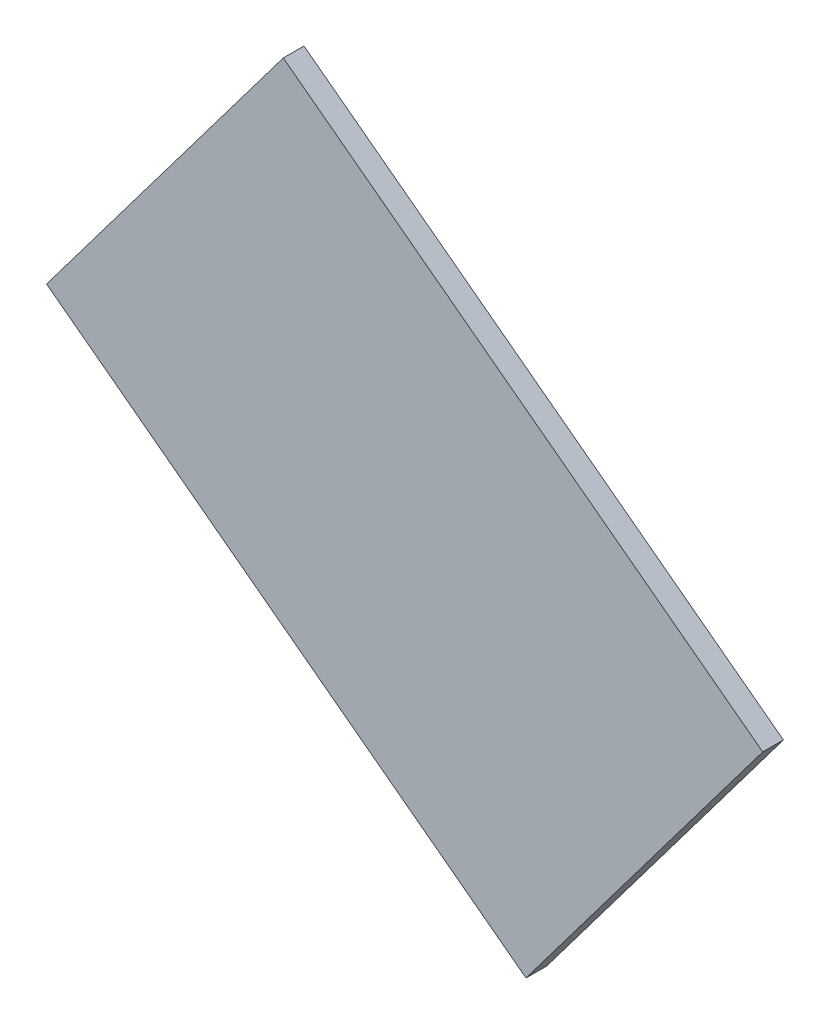
ISO-10303-21;
HEADER;
FILE_DESCRIPTION(('STEP AP214'),'2;1');
FILE_NAME('part.step','',(''),(''),'','','');
FILE_SCHEMA(('AUTOMOTIVE_DESIGN { 1 0 10303 214 1 1 1 1 }'));
ENDSEC;
DATA;
#1=APPLICATION_CONTEXT('core data for automotive mechanical design processes');
#2=APPLICATION_PROTOCOL_DEFINITION('international standard','automotive_design',2000,#1);
#3=PRODUCT_CONTEXT('',#1,'mechanical');
#4=PRODUCT('Part','Part','',(#3));
#5=PRODUCT_RELATED_PRODUCT_CATEGORY('part','',(#4));
#6=PRODUCT_DEFINITION_FORMATION('','',#4);
#7=PRODUCT_DEFINITION_CONTEXT('part definition',#1,'design');
#8=PRODUCT_DEFINITION('design','',#6,#7);
#9=PRODUCT_DEFINITION_SHAPE('','',#8);
#10=(LENGTH_UNIT() NAMED_UNIT(*) SI_UNIT(.MILLI.,.METRE.));
#11=(NAMED_UNIT(*) PLANE_ANGLE_UNIT() SI_UNIT($,.RADIAN.));
#12=(NAMED_UNIT(*) SI_UNIT($,.STERADIAN.) SOLID_ANGLE_UNIT());
#13=UNCERTAINTY_MEASURE_WITH_UNIT(LENGTH_MEASURE(1.E-05),#10,'distance_accuracy_value','');
#14=(GEOMETRIC_REPRESENTATION_CONTEXT(3) GLOBAL_UNCERTAINTY_ASSIGNED_CONTEXT((#13)) GLOBAL_UNIT_ASSIGNED_CONTEXT((#10,
#11,#12)) REPRESENTATION_CONTEXT('',''));
#15=CARTESIAN_POINT('',(0.,0.,0.));
#16=DIRECTION('',(0.,0.,1.));
#17=DIRECTION('',(1.,0.,0.));
#18=AXIS2_PLACEMENT_3D('',#15,#16,#17);
#19=CARTESIAN_POINT('',(-19.70685207874,10.184331610387,-2.061602139255));
#20=DIRECTION('',(0.,8.74227767714697E-08,-0.999999999999996));
#21=DIRECTION('',(0.,0.999999999999996,8.74227767714697E-08));
#22=AXIS2_PLACEMENT_3D('',#19,#20,#21);
#23=PLANE('',#22);
#24=DIRECTION('',(-0.601815050112246,-0.798635489731326,0.));
#25=VECTOR('',#24,1.);
#26=CARTESIAN_POINT('',(-20.86487353885,11.056963433049,-2.061602062967));
#27=LINE('',#26,#25);
#28=CARTESIAN_POINT('',(-20.8648735393751,11.0569634345377,-2.06160206296703));
#29=VERTEX_POINT('',#28);
#30=CARTESIAN_POINT('',(-20.2931492417742,11.8156671486889,-2.06160201322106));
#31=VERTEX_POINT('',#30);
#32=EDGE_CURVE('E61',#29,#31,#27,.F.);
#33=ORIENTED_EDGE('',*,*,#32,.F.);
#34=DIRECTION('',(-0.798635489731326,0.601815050112246,0.));
#35=VECTOR('',#34,1.);
#36=CARTESIAN_POINT('',(-19.70685207874,10.184331610387,-2.061602062967));
#37=LINE('',#36,#35);
#38=CARTESIAN_POINT('',(-19.7068520782148,10.184331611084,-2.061602120183));
#39=VERTEX_POINT('',#38);
#40=EDGE_CURVE('E56',#29,#39,#37,.F.);
#41=ORIENTED_EDGE('',*,*,#40,.T.);
#42=DIRECTION('',(-0.601815050112246,-0.798635489731326,0.));
#43=VECTOR('',#42,1.);
#44=CARTESIAN_POINT('',(-19.70685207874,10.184331610387,-2.061602139255));
#45=LINE('',#44,#43);
#46=CARTESIAN_POINT('',(-19.135127781139,10.9430353256303,-2.06160207043701));
#47=VERTEX_POINT('',#46);
#48=EDGE_CURVE('E20',#39,#47,#45,.F.);
#49=ORIENTED_EDGE('',*,*,#48,.T.);
#50=DIRECTION('',(-0.798635489731326,0.601815050112246,0.));
#51=VECTOR('',#50,1.);
#52=CARTESIAN_POINT('',(-19.13512778114,10.943035325631,-2.061601996639));
#53=LINE('',#52,#51);
#54=EDGE_CURVE('E79',#31,#47,#53,.F.);
#55=ORIENTED_EDGE('',*,*,#54,.F.);
#56=EDGE_LOOP('',(#33,#41,#49,#55));
#57=FACE_BOUND('',#56,.T.);
#58=ADVANCED_FACE('F17',(#57),#23,.F.);
#59=CARTESIAN_POINT('',(-19.70685207874,10.184331610387,-2.061602139255));
#60=DIRECTION('',(-0.798635489731325,0.601815050112245,5.26123433841814E-08));
#61=DIRECTION('',(-0.601815050112246,-0.798635489731326,0.));
#62=AXIS2_PLACEMENT_3D('',#59,#60,#61);
#63=PLANE('',#62);
#64=DIRECTION('',(-4.20180838726443E-08,-5.57598767012264E-08,0.999999999999998));
#65=VECTOR('',#64,1.);
#66=CARTESIAN_POINT('',(-19.13512778114,10.943035325631,-2.061602072927));
#67=LINE('',#66,#65);
#68=CARTESIAN_POINT('',(-19.1351277816633,10.9430353282111,-2.111602072927));
#69=VERTEX_POINT('',#68);
#70=EDGE_CURVE('E68',#47,#69,#67,.F.);
#71=ORIENTED_EDGE('',*,*,#70,.F.);
#72=ORIENTED_EDGE('',*,*,#48,.F.);
#73=DIRECTION('',(-4.20180838726443E-08,-5.57598767012264E-08,0.999999999999998));
#74=VECTOR('',#73,1.);
#75=CARTESIAN_POINT('',(-19.70685207874,10.184331610387,-2.061602139255));
#76=LINE('',#75,#74);
#77=CARTESIAN_POINT('',(-19.7068520782148,10.1843316143623,-2.111602106091));
#78=VERTEX_POINT('',#77);
#79=EDGE_CURVE('E63',#39,#78,#76,.F.);
#80=ORIENTED_EDGE('',*,*,#79,.T.);
#81=DIRECTION('',(-0.601815050107669,-0.798635489734772,-6.98189317949345E-08));
#82=VECTOR('',#81,1.);
#83=CARTESIAN_POINT('',(-19.13512778114,10.943035330003,-2.11160207292702));
#84=LINE('',#83,#82);
#85=EDGE_CURVE('E83',#69,#78,#84,.T.);
#86=ORIENTED_EDGE('',*,*,#85,.F.);
#87=EDGE_LOOP('',(#71,#72,#80,#86));
#88=FACE_BOUND('',#87,.T.);
#89=ADVANCED_FACE('F65',(#88),#63,.F.);
#90=CARTESIAN_POINT('',(-19.70685207874,10.184331610387,-2.061602139255));
#91=DIRECTION('',(0.601815050112244,0.798635489731324,6.98189316880783E-08));
#92=DIRECTION('',(-0.798635489731326,0.601815050112246,0.));
#93=AXIS2_PLACEMENT_3D('',#90,#91,#92);
#94=PLANE('',#93);
#95=DIRECTION('',(-0.798635489731469,0.601815050112054,5.2612343361297E-08));
#96=VECTOR('',#95,1.);
#97=CARTESIAN_POINT('',(-19.70685207874,10.184331614758,-2.111602139255));
#98=LINE('',#97,#96);
#99=CARTESIAN_POINT('',(-20.8648735388499,11.0569634374202,-2.11160208452903));
#100=VERTEX_POINT('',#99);
#101=EDGE_CURVE('E72',#78,#100,#98,.T.);
#102=ORIENTED_EDGE('',*,*,#101,.F.);
#103=ORIENTED_EDGE('',*,*,#79,.F.);
#104=ORIENTED_EDGE('',*,*,#40,.F.);
#105=DIRECTION('',(4.20180846245384E-08,-3.16629000702738E-08,0.999999999999999));
#106=VECTOR('',#105,1.);
#107=CARTESIAN_POINT('',(-20.8648735367492,11.0569634358369,-2.061602062967));
#108=LINE('',#107,#106);
#109=EDGE_CURVE('E74',#100,#29,#108,.T.);
#110=ORIENTED_EDGE('',*,*,#109,.F.);
#111=EDGE_LOOP('',(#102,#103,#104,#110));
#112=FACE_BOUND('',#111,.T.);
#113=ADVANCED_FACE('F70',(#112),#94,.F.);
#114=CARTESIAN_POINT('',(-20.86487353885,11.056963433049,-2.061602062967));
#115=DIRECTION('',(-0.798635489731325,0.601815050112245,5.26123433841814E-08));
#116=DIRECTION('',(-0.601815050112246,-0.798635489731326,0.));
#117=AXIS2_PLACEMENT_3D('',#114,#115,#116);
#118=PLANE('',#117);
#119=DIRECTION('',(-4.20180838726443E-08,-5.57598767012264E-08,0.999999999999998));
#120=VECTOR('',#119,1.);
#121=CARTESIAN_POINT('',(-20.2931492433511,11.8156671498767,-2.061602072927));
#122=LINE('',#121,#120);
#123=CARTESIAN_POINT('',(-20.2931492422983,11.8156671512694,-2.11160201571103));
#124=VERTEX_POINT('',#123);
#125=EDGE_CURVE('E35',#124,#31,#122,.T.);
#126=ORIENTED_EDGE('',*,*,#125,.F.);
#127=DIRECTION('',(0.601815050107669,0.798635489734772,6.98189317949345E-08));
#128=VECTOR('',#127,1.);
#129=CARTESIAN_POINT('',(-20.86487353885,11.05696343742,-2.1116020629671));
#130=LINE('',#129,#128);
#131=EDGE_CURVE('E26',#100,#124,#130,.T.);
#132=ORIENTED_EDGE('',*,*,#131,.F.);
#133=ORIENTED_EDGE('',*,*,#109,.T.);
#134=ORIENTED_EDGE('',*,*,#32,.T.);
#135=EDGE_LOOP('',(#126,#132,#133,#134));
#136=FACE_BOUND('',#135,.T.);
#137=ADVANCED_FACE('F89',(#136),#118,.T.);
#138=CARTESIAN_POINT('',(-19.13512778114,10.943035325631,-2.061602072927));
#139=DIRECTION('',(0.601815050112244,0.798635489731324,6.98189316880783E-08));
#140=DIRECTION('',(-0.798635489731326,0.601815050112246,0.));
#141=AXIS2_PLACEMENT_3D('',#138,#139,#140);
#142=PLANE('',#141);
#143=DIRECTION('',(0.798635489731469,-0.601815050112054,-5.2612343361297E-08));
#144=VECTOR('',#143,1.);
#145=CARTESIAN_POINT('',(-20.29314924125,11.815667152665,-2.11160199663912));
#146=LINE('',#145,#144);
#147=EDGE_CURVE('E11',#124,#69,#146,.T.);
#148=ORIENTED_EDGE('',*,*,#147,.F.);
#149=ORIENTED_EDGE('',*,*,#125,.T.);
#150=ORIENTED_EDGE('',*,*,#54,.T.);
#151=ORIENTED_EDGE('',*,*,#70,.T.);
#152=EDGE_LOOP('',(#148,#149,#150,#151));
#153=FACE_BOUND('',#152,.T.);
#154=ADVANCED_FACE('F91',(#153),#142,.T.);
#155=CARTESIAN_POINT('',(-19.70685207874,10.184331614758,-2.111602139255));
#156=DIRECTION('',(0.,8.74227767714697E-08,-0.999999999999996));
#157=DIRECTION('',(0.,0.999999999999996,8.74227767714697E-08));
#158=AXIS2_PLACEMENT_3D('',#155,#156,#157);
#159=PLANE('',#158);
#160=ORIENTED_EDGE('',*,*,#131,.T.);
#161=ORIENTED_EDGE('',*,*,#147,.T.);
#162=ORIENTED_EDGE('',*,*,#85,.T.);
#163=ORIENTED_EDGE('',*,*,#101,.T.);
#164=EDGE_LOOP('',(#160,#161,#162,#163));
#165=FACE_BOUND('',#164,.T.);
#166=ADVANCED_FACE('F88',(#165),#159,.T.);
#167=CLOSED_SHELL('',(#58,#89,#113,#137,#154,#166));
#168=MANIFOLD_SOLID_BREP('B1',#167);
#169=ADVANCED_BREP_SHAPE_REPRESENTATION('',(#18,#168),#14);
#170=SHAPE_DEFINITION_REPRESENTATION(#9,#169);
ENDSEC;
END-ISO-10303-21;
